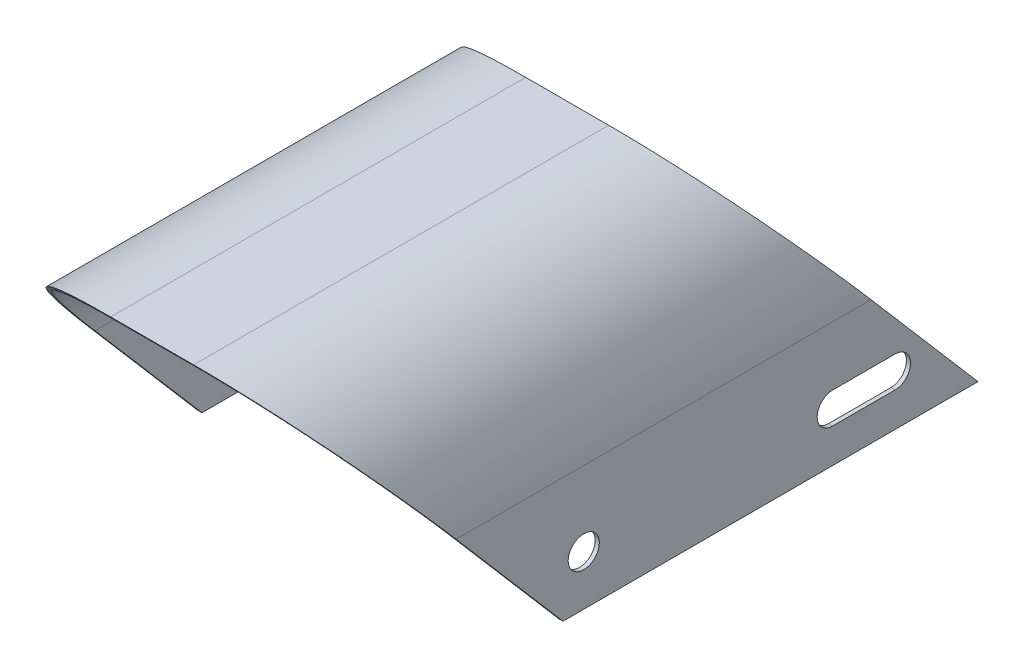
ISO-10303-21;
HEADER;
FILE_DESCRIPTION(('STEP AP214'),'2;1');
FILE_NAME('part.step','',(''),(''),'','','');
FILE_SCHEMA(('AUTOMOTIVE_DESIGN { 1 0 10303 214 1 1 1 1 }'));
ENDSEC;
DATA;
#1=APPLICATION_CONTEXT('core data for automotive mechanical design processes');
#2=APPLICATION_PROTOCOL_DEFINITION('international standard','automotive_design',2000,#1);
#3=PRODUCT_CONTEXT('',#1,'mechanical');
#4=PRODUCT('Part','Part','',(#3));
#5=PRODUCT_RELATED_PRODUCT_CATEGORY('part','',(#4));
#6=PRODUCT_DEFINITION_FORMATION('','',#4);
#7=PRODUCT_DEFINITION_CONTEXT('part definition',#1,'design');
#8=PRODUCT_DEFINITION('design','',#6,#7);
#9=PRODUCT_DEFINITION_SHAPE('','',#8);
#10=(LENGTH_UNIT() NAMED_UNIT(*) SI_UNIT(.MILLI.,.METRE.));
#11=(NAMED_UNIT(*) PLANE_ANGLE_UNIT() SI_UNIT($,.RADIAN.));
#12=(NAMED_UNIT(*) SI_UNIT($,.STERADIAN.) SOLID_ANGLE_UNIT());
#13=UNCERTAINTY_MEASURE_WITH_UNIT(LENGTH_MEASURE(1.E-05),#10,'distance_accuracy_value','');
#14=(GEOMETRIC_REPRESENTATION_CONTEXT(3) GLOBAL_UNCERTAINTY_ASSIGNED_CONTEXT((#13)) GLOBAL_UNIT_ASSIGNED_CONTEXT((#10,
#11,#12)) REPRESENTATION_CONTEXT('',''));
#15=CARTESIAN_POINT('',(0.,0.,0.));
#16=DIRECTION('',(0.,0.,1.));
#17=DIRECTION('',(1.,0.,0.));
#18=AXIS2_PLACEMENT_3D('',#15,#16,#17);
#19=CARTESIAN_POINT('',(-5.60292589790817,0.,196.85));
#20=DIRECTION('',(1.,0.,0.));
#21=DIRECTION('',(0.,0.,-1.));
#22=AXIS2_PLACEMENT_3D('',#19,#20,#21);
#23=PLANE('',#22);
#24=DIRECTION('',(0.,0.,1.));
#25=VECTOR('',#24,1.);
#26=CARTESIAN_POINT('',(-5.60292589790817,10.4775,25.4));
#27=LINE('',#26,#25);
#28=CARTESIAN_POINT('',(-5.60292589790817,10.4775,25.4));
#29=VERTEX_POINT('',#28);
#30=CARTESIAN_POINT('',(-5.60292589790817,10.4775,44.45));
#31=VERTEX_POINT('',#30);
#32=EDGE_CURVE('E191',#29,#31,#27,.T.);
#33=ORIENTED_EDGE('',*,*,#32,.F.);
#34=CARTESIAN_POINT('',(-5.60292589790817,15.24,25.4));
#35=DIRECTION('',(-1.,0.,0.));
#36=DIRECTION('',(0.,0.,1.));
#37=AXIS2_PLACEMENT_3D('',#34,#35,#36);
#38=CIRCLE('',#37,4.7625);
#39=CARTESIAN_POINT('',(-5.60292589790817,20.0025,25.4));
#40=VERTEX_POINT('',#39);
#41=EDGE_CURVE('E56',#40,#29,#38,.T.);
#42=ORIENTED_EDGE('',*,*,#41,.F.);
#43=DIRECTION('',(0.,0.,-1.));
#44=VECTOR('',#43,1.);
#45=CARTESIAN_POINT('',(-5.60292589790817,20.0025,25.4));
#46=LINE('',#45,#44);
#47=CARTESIAN_POINT('',(-5.60292589790817,20.0025,44.45));
#48=VERTEX_POINT('',#47);
#49=EDGE_CURVE('E199',#48,#40,#46,.T.);
#50=ORIENTED_EDGE('',*,*,#49,.F.);
#51=CARTESIAN_POINT('',(-5.60292589790817,15.24,44.45));
#52=DIRECTION('',(-1.,0.,0.));
#53=DIRECTION('',(0.,0.,-1.));
#54=AXIS2_PLACEMENT_3D('',#51,#52,#53);
#55=CIRCLE('',#54,4.7625);
#56=EDGE_CURVE('E181',#31,#48,#55,.T.);
#57=ORIENTED_EDGE('',*,*,#56,.F.);
#58=EDGE_LOOP('',(#33,#42,#50,#57));
#59=FACE_BOUND('',#58,.T.);
#60=CARTESIAN_POINT('',(-5.60292589790817,15.24,120.65));
#61=DIRECTION('',(-1.,0.,0.));
#62=DIRECTION('',(0.,0.,1.));
#63=AXIS2_PLACEMENT_3D('',#60,#61,#62);
#64=CIRCLE('',#63,4.76250000000004);
#65=CARTESIAN_POINT('',(-5.60292589790817,15.24,125.4125));
#66=VERTEX_POINT('',#65);
#67=EDGE_CURVE('E216',#66,#66,#64,.T.);
#68=ORIENTED_EDGE('',*,*,#67,.F.);
#69=EDGE_LOOP('',(#68));
#70=FACE_BOUND('',#69,.T.);
#71=DIRECTION('',(0.,0.,-1.));
#72=VECTOR('',#71,1.);
#73=CARTESIAN_POINT('',(-5.60292589790815,38.1,196.85));
#74=LINE('',#73,#72);
#75=CARTESIAN_POINT('',(-5.60292589790816,38.1,159.7421875));
#76=VERTEX_POINT('',#75);
#77=CARTESIAN_POINT('',(-5.60292589790816,38.1,32.7421875));
#78=VERTEX_POINT('',#77);
#79=EDGE_CURVE('E341',#76,#78,#74,.T.);
#80=ORIENTED_EDGE('',*,*,#79,.T.);
#81=DIRECTION('',(0.,0.758419483098748,0.651766743287986));
#82=VECTOR('',#81,1.);
#83=CARTESIAN_POINT('',(-5.60292589790817,0.,0.));
#84=LINE('',#83,#82);
#85=CARTESIAN_POINT('',(-5.60292589790817,0.,0.));
#86=VERTEX_POINT('',#85);
#87=EDGE_CURVE('E259',#86,#78,#84,.T.);
#88=ORIENTED_EDGE('',*,*,#87,.F.);
#89=DIRECTION('',(0.,0.,-1.));
#90=VECTOR('',#89,1.);
#91=CARTESIAN_POINT('',(-5.60292589790817,0.,196.85));
#92=LINE('',#91,#90);
#93=CARTESIAN_POINT('',(-5.60292589790817,0.,127.));
#94=VERTEX_POINT('',#93);
#95=EDGE_CURVE('E392',#94,#86,#92,.T.);
#96=ORIENTED_EDGE('',*,*,#95,.F.);
#97=DIRECTION('',(0.,-0.758419483098748,-0.651766743287987));
#98=VECTOR('',#97,1.);
#99=CARTESIAN_POINT('',(-5.60292589790817,81.2799999999999,196.85));
#100=LINE('',#99,#98);
#101=EDGE_CURVE('E258',#76,#94,#100,.T.);
#102=ORIENTED_EDGE('',*,*,#101,.F.);
#103=EDGE_LOOP('',(#80,#88,#96,#102));
#104=FACE_BOUND('',#103,.T.);
#105=ADVANCED_FACE('F41',(#59,#70,#104),#23,.F.);
#106=CARTESIAN_POINT('',(-5.60292589790817,0.,196.85));
#107=DIRECTION('',(0.,1.,0.));
#108=DIRECTION('',(-1.,0.,0.));
#109=AXIS2_PLACEMENT_3D('',#106,#107,#108);
#110=PLANE('',#109);
#111=DIRECTION('',(0.,0.,-1.));
#112=VECTOR('',#111,1.);
#113=CARTESIAN_POINT('',(-4.33292589790817,0.,196.85));
#114=LINE('',#113,#112);
#115=CARTESIAN_POINT('',(-4.3329258979081,0.,127.));
#116=VERTEX_POINT('',#115);
#117=CARTESIAN_POINT('',(-4.33292589790817,0.,0.));
#118=VERTEX_POINT('',#117);
#119=EDGE_CURVE('E388',#116,#118,#114,.T.);
#120=ORIENTED_EDGE('',*,*,#119,.F.);
#121=DIRECTION('',(-1.,0.,0.));
#122=VECTOR('',#121,1.);
#123=CARTESIAN_POINT('',(146.797074102092,0.,127.));
#124=LINE('',#123,#122);
#125=EDGE_CURVE('E270',#116,#94,#124,.T.);
#126=ORIENTED_EDGE('',*,*,#125,.T.);
#127=ORIENTED_EDGE('',*,*,#95,.T.);
#128=DIRECTION('',(1.,0.,0.));
#129=VECTOR('',#128,1.);
#130=CARTESIAN_POINT('',(-5.60292589790817,0.,0.));
#131=LINE('',#130,#129);
#132=EDGE_CURVE('E337',#86,#118,#131,.T.);
#133=ORIENTED_EDGE('',*,*,#132,.T.);
#134=EDGE_LOOP('',(#120,#126,#127,#133));
#135=FACE_BOUND('',#134,.T.);
#136=ADVANCED_FACE('F456',(#135),#110,.F.);
#137=CARTESIAN_POINT('',(-4.33292589790817,0.,196.85));
#138=DIRECTION('',(-1.,0.,0.));
#139=DIRECTION('',(0.,0.,1.));
#140=AXIS2_PLACEMENT_3D('',#137,#138,#139);
#141=PLANE('',#140);
#142=DIRECTION('',(0.,0.,-1.));
#143=VECTOR('',#142,1.);
#144=CARTESIAN_POINT('',(-4.33292589790817,20.0025,196.85));
#145=LINE('',#144,#143);
#146=CARTESIAN_POINT('',(-4.3329258979081,20.0025,44.45));
#147=VERTEX_POINT('',#146);
#148=CARTESIAN_POINT('',(-4.3329258979081,20.0025,25.4));
#149=VERTEX_POINT('',#148);
#150=EDGE_CURVE('E246',#147,#149,#145,.T.);
#151=ORIENTED_EDGE('',*,*,#150,.T.);
#152=CARTESIAN_POINT('',(-4.33292589790815,15.24,25.4));
#153=DIRECTION('',(-1.,0.,0.));
#154=DIRECTION('',(0.,0.,1.));
#155=AXIS2_PLACEMENT_3D('',#152,#153,#154);
#156=CIRCLE('',#155,4.7625);
#157=CARTESIAN_POINT('',(-4.3329258979081,10.4775,25.4));
#158=VERTEX_POINT('',#157);
#159=EDGE_CURVE('E254',#149,#158,#156,.T.);
#160=ORIENTED_EDGE('',*,*,#159,.T.);
#161=DIRECTION('',(0.,0.,1.));
#162=VECTOR('',#161,1.);
#163=CARTESIAN_POINT('',(-4.33292589790817,10.4775,196.85));
#164=LINE('',#163,#162);
#165=CARTESIAN_POINT('',(-4.33292589790817,10.4775,44.45));
#166=VERTEX_POINT('',#165);
#167=EDGE_CURVE('E233',#158,#166,#164,.T.);
#168=ORIENTED_EDGE('',*,*,#167,.T.);
#169=CARTESIAN_POINT('',(-4.33292589790815,15.24,44.45));
#170=DIRECTION('',(-1.,0.,0.));
#171=DIRECTION('',(0.,0.,1.));
#172=AXIS2_PLACEMENT_3D('',#169,#170,#171);
#173=CIRCLE('',#172,4.7625);
#174=EDGE_CURVE('E184',#166,#147,#173,.T.);
#175=ORIENTED_EDGE('',*,*,#174,.T.);
#176=EDGE_LOOP('',(#151,#160,#168,#175));
#177=FACE_BOUND('',#176,.T.);
#178=CARTESIAN_POINT('',(-4.33292589790815,15.24,120.65));
#179=DIRECTION('',(-1.,0.,0.));
#180=DIRECTION('',(0.,0.,1.));
#181=AXIS2_PLACEMENT_3D('',#178,#179,#180);
#182=CIRCLE('',#181,4.76250000000004);
#183=CARTESIAN_POINT('',(-4.33292589790812,15.24,125.4125));
#184=VERTEX_POINT('',#183);
#185=EDGE_CURVE('E224',#184,#184,#182,.T.);
#186=ORIENTED_EDGE('',*,*,#185,.T.);
#187=EDGE_LOOP('',(#186));
#188=FACE_BOUND('',#187,.T.);
#189=ORIENTED_EDGE('',*,*,#119,.T.);
#190=DIRECTION('',(0.,0.758419483098748,0.651766743287987));
#191=VECTOR('',#190,1.);
#192=CARTESIAN_POINT('',(-4.33292589790817,97.3054346299677,83.6218578851284));
#193=LINE('',#192,#191);
#194=CARTESIAN_POINT('',(-4.33292589790817,38.1,32.7421875));
#195=VERTEX_POINT('',#194);
#196=EDGE_CURVE('E301',#118,#195,#193,.T.);
#197=ORIENTED_EDGE('',*,*,#196,.T.);
#198=DIRECTION('',(0.,0.,-1.));
#199=VECTOR('',#198,1.);
#200=CARTESIAN_POINT('',(-4.33292589790817,38.1,196.85));
#201=LINE('',#200,#199);
#202=CARTESIAN_POINT('',(-4.33292589790817,38.1,159.7421875));
#203=VERTEX_POINT('',#202);
#204=EDGE_CURVE('E384',#203,#195,#201,.T.);
#205=ORIENTED_EDGE('',*,*,#204,.F.);
#206=DIRECTION('',(0.,-0.758419483098748,-0.651766743287987));
#207=VECTOR('',#206,1.);
#208=CARTESIAN_POINT('',(-4.33292589790817,34.5277348686982,156.672272152788));
#209=LINE('',#208,#207);
#210=EDGE_CURVE('E333',#203,#116,#209,.T.);
#211=ORIENTED_EDGE('',*,*,#210,.T.);
#212=EDGE_LOOP('',(#189,#197,#205,#211));
#213=FACE_BOUND('',#212,.T.);
#214=ADVANCED_FACE('F453',(#177,#188,#213),#141,.F.);
#215=CARTESIAN_POINT('',(37.5770741020918,38.1,196.85));
#216=DIRECTION('',(0.,0.,-1.));
#217=DIRECTION('',(-1.,0.,0.));
#218=AXIS2_PLACEMENT_3D('',#215,#216,#217);
#219=CYLINDRICAL_SURFACE('',#218,41.91);
#220=ORIENTED_EDGE('',*,*,#204,.T.);
#221=CARTESIAN_POINT('',(37.5770741020918,38.1,32.7421875));
#222=DIRECTION('',(0.,-0.651766743287986,0.758419483098748));
#223=DIRECTION('',(0.,-0.758419483098748,-0.651766743287986));
#224=AXIS2_PLACEMENT_3D('',#221,#222,#223);
#225=ELLIPSE('',#224,55.2596563431681,41.91);
#226=CARTESIAN_POINT('',(37.5770741020918,80.01,68.75859375));
#227=VERTEX_POINT('',#226);
#228=EDGE_CURVE('E297',#195,#227,#225,.F.);
#229=ORIENTED_EDGE('',*,*,#228,.T.);
#230=DIRECTION('',(0.,0.,-1.));
#231=VECTOR('',#230,1.);
#232=CARTESIAN_POINT('',(37.5770741020918,80.01,196.85));
#233=LINE('',#232,#231);
#234=CARTESIAN_POINT('',(37.5770741020918,80.01,195.75859375));
#235=VERTEX_POINT('',#234);
#236=EDGE_CURVE('E380',#235,#227,#233,.T.);
#237=ORIENTED_EDGE('',*,*,#236,.F.);
#238=CARTESIAN_POINT('',(37.5770741020918,38.1,159.7421875));
#239=DIRECTION('',(0.,0.651766743287987,-0.758419483098748));
#240=DIRECTION('',(0.,-0.758419483098748,-0.651766743287987));
#241=AXIS2_PLACEMENT_3D('',#238,#239,#240);
#242=ELLIPSE('',#241,55.2596563431681,41.91);
#243=EDGE_CURVE('E329',#235,#203,#242,.F.);
#244=ORIENTED_EDGE('',*,*,#243,.T.);
#245=EDGE_LOOP('',(#220,#229,#237,#244));
#246=FACE_BOUND('',#245,.T.);
#247=ADVANCED_FACE('F450',(#246),#219,.F.);
#248=CARTESIAN_POINT('',(37.5770741020918,80.01,196.85));
#249=DIRECTION('',(0.,1.,0.));
#250=DIRECTION('',(-1.,0.,0.));
#251=AXIS2_PLACEMENT_3D('',#248,#249,#250);
#252=PLANE('',#251);
#253=ORIENTED_EDGE('',*,*,#236,.T.);
#254=DIRECTION('',(1.,0.,0.));
#255=VECTOR('',#254,1.);
#256=CARTESIAN_POINT('',(37.5770741020919,80.01,68.75859375));
#257=LINE('',#256,#255);
#258=CARTESIAN_POINT('',(62.9770741020918,80.01,68.75859375));
#259=VERTEX_POINT('',#258);
#260=EDGE_CURVE('E293',#227,#259,#257,.T.);
#261=ORIENTED_EDGE('',*,*,#260,.T.);
#262=DIRECTION('',(0.,0.,-1.));
#263=VECTOR('',#262,1.);
#264=CARTESIAN_POINT('',(62.9770741020918,80.01,196.85));
#265=LINE('',#264,#263);
#266=CARTESIAN_POINT('',(62.9770741020918,80.01,195.75859375));
#267=VERTEX_POINT('',#266);
#268=EDGE_CURVE('E376',#267,#259,#265,.T.);
#269=ORIENTED_EDGE('',*,*,#268,.F.);
#270=DIRECTION('',(-1.,0.,0.));
#271=VECTOR('',#270,1.);
#272=CARTESIAN_POINT('',(37.5770741020918,80.01,195.75859375));
#273=LINE('',#272,#271);
#274=EDGE_CURVE('E325',#267,#235,#273,.T.);
#275=ORIENTED_EDGE('',*,*,#274,.T.);
#276=EDGE_LOOP('',(#253,#261,#269,#275));
#277=FACE_BOUND('',#276,.T.);
#278=ADVANCED_FACE('F447',(#277),#252,.F.);
#279=CARTESIAN_POINT('',(62.9770741020918,38.1,196.85));
#280=DIRECTION('',(0.,0.,-1.));
#281=DIRECTION('',(-1.,0.,0.));
#282=AXIS2_PLACEMENT_3D('',#279,#280,#281);
#283=CYLINDRICAL_SURFACE('',#282,41.91);
#284=ORIENTED_EDGE('',*,*,#268,.T.);
#285=CARTESIAN_POINT('',(62.9770741020918,38.1,32.7421875));
#286=DIRECTION('',(0.,-0.651766743287986,0.758419483098748));
#287=DIRECTION('',(0.,-0.758419483098748,-0.651766743287986));
#288=AXIS2_PLACEMENT_3D('',#285,#286,#287);
#289=ELLIPSE('',#288,55.2596563431681,41.91);
#290=CARTESIAN_POINT('',(104.887074102092,38.1,32.7421875));
#291=VERTEX_POINT('',#290);
#292=EDGE_CURVE('E289',#259,#291,#289,.F.);
#293=ORIENTED_EDGE('',*,*,#292,.T.);
#294=DIRECTION('',(0.,0.,-1.));
#295=VECTOR('',#294,1.);
#296=CARTESIAN_POINT('',(104.887074102092,38.1,196.85));
#297=LINE('',#296,#295);
#298=CARTESIAN_POINT('',(104.887074102092,38.1,159.7421875));
#299=VERTEX_POINT('',#298);
#300=EDGE_CURVE('E372',#299,#291,#297,.T.);
#301=ORIENTED_EDGE('',*,*,#300,.F.);
#302=CARTESIAN_POINT('',(62.9770741020918,38.1,159.7421875));
#303=DIRECTION('',(0.,0.651766743287987,-0.758419483098748));
#304=DIRECTION('',(0.,-0.758419483098748,-0.651766743287987));
#305=AXIS2_PLACEMENT_3D('',#302,#303,#304);
#306=ELLIPSE('',#305,55.2596563431681,41.91);
#307=EDGE_CURVE('E321',#299,#267,#306,.F.);
#308=ORIENTED_EDGE('',*,*,#307,.T.);
#309=EDGE_LOOP('',(#284,#293,#301,#308));
#310=FACE_BOUND('',#309,.T.);
#311=ADVANCED_FACE('F436',(#310),#283,.F.);
#312=CARTESIAN_POINT('',(104.887074102092,0.,196.85));
#313=DIRECTION('',(1.,0.,0.));
#314=DIRECTION('',(0.,0.,-1.));
#315=AXIS2_PLACEMENT_3D('',#312,#313,#314);
#316=PLANE('',#315);
#317=DIRECTION('',(0.,0.,-1.));
#318=VECTOR('',#317,1.);
#319=CARTESIAN_POINT('',(104.887074102092,10.4775,196.85));
#320=LINE('',#319,#318);
#321=CARTESIAN_POINT('',(104.887074102092,10.4775,44.45));
#322=VERTEX_POINT('',#321);
#323=CARTESIAN_POINT('',(104.887074102092,10.4775,25.4));
#324=VERTEX_POINT('',#323);
#325=EDGE_CURVE('E229',#322,#324,#320,.T.);
#326=ORIENTED_EDGE('',*,*,#325,.T.);
#327=CARTESIAN_POINT('',(104.887074102092,15.24,25.4));
#328=DIRECTION('',(1.,0.,0.));
#329=DIRECTION('',(0.,0.,-1.));
#330=AXIS2_PLACEMENT_3D('',#327,#328,#329);
#331=CIRCLE('',#330,4.7625);
#332=CARTESIAN_POINT('',(104.887074102092,20.0025,25.4));
#333=VERTEX_POINT('',#332);
#334=EDGE_CURVE('E250',#324,#333,#331,.T.);
#335=ORIENTED_EDGE('',*,*,#334,.T.);
#336=DIRECTION('',(0.,0.,1.));
#337=VECTOR('',#336,1.);
#338=CARTESIAN_POINT('',(104.887074102092,20.0025,196.85));
#339=LINE('',#338,#337);
#340=CARTESIAN_POINT('',(104.887074102092,20.0025,44.45));
#341=VERTEX_POINT('',#340);
#342=EDGE_CURVE('E242',#333,#341,#339,.T.);
#343=ORIENTED_EDGE('',*,*,#342,.T.);
#344=CARTESIAN_POINT('',(104.887074102092,15.24,44.45));
#345=DIRECTION('',(1.,0.,0.));
#346=DIRECTION('',(0.,0.,-1.));
#347=AXIS2_PLACEMENT_3D('',#344,#345,#346);
#348=CIRCLE('',#347,4.7625);
#349=EDGE_CURVE('E236',#341,#322,#348,.T.);
#350=ORIENTED_EDGE('',*,*,#349,.T.);
#351=EDGE_LOOP('',(#326,#335,#343,#350));
#352=FACE_BOUND('',#351,.T.);
#353=CARTESIAN_POINT('',(104.887074102092,15.24,120.65));
#354=DIRECTION('',(1.,0.,0.));
#355=DIRECTION('',(0.,0.,-1.));
#356=AXIS2_PLACEMENT_3D('',#353,#354,#355);
#357=CIRCLE('',#356,4.76250000000004);
#358=CARTESIAN_POINT('',(104.887074102092,15.24,125.4125));
#359=VERTEX_POINT('',#358);
#360=EDGE_CURVE('E220',#359,#359,#357,.T.);
#361=ORIENTED_EDGE('',*,*,#360,.T.);
#362=EDGE_LOOP('',(#361));
#363=FACE_BOUND('',#362,.T.);
#364=ORIENTED_EDGE('',*,*,#300,.T.);
#365=DIRECTION('',(0.,-0.758419483098748,-0.651766743287987));
#366=VECTOR('',#365,1.);
#367=CARTESIAN_POINT('',(104.887074102092,97.3054346299677,83.6218578851285));
#368=LINE('',#367,#366);
#369=CARTESIAN_POINT('',(104.887074102092,0.,0.));
#370=VERTEX_POINT('',#369);
#371=EDGE_CURVE('E285',#291,#370,#368,.T.);
#372=ORIENTED_EDGE('',*,*,#371,.T.);
#373=DIRECTION('',(0.,0.,-1.));
#374=VECTOR('',#373,1.);
#375=CARTESIAN_POINT('',(104.887074102092,0.,196.85));
#376=LINE('',#375,#374);
#377=CARTESIAN_POINT('',(104.887074102092,0.,127.));
#378=VERTEX_POINT('',#377);
#379=EDGE_CURVE('E368',#378,#370,#376,.T.);
#380=ORIENTED_EDGE('',*,*,#379,.F.);
#381=DIRECTION('',(0.,0.758419483098748,0.651766743287987));
#382=VECTOR('',#381,1.);
#383=CARTESIAN_POINT('',(104.887074102092,34.5277348686982,156.672272152788));
#384=LINE('',#383,#382);
#385=EDGE_CURVE('E317',#378,#299,#384,.T.);
#386=ORIENTED_EDGE('',*,*,#385,.T.);
#387=EDGE_LOOP('',(#364,#372,#380,#386));
#388=FACE_BOUND('',#387,.T.);
#389=ADVANCED_FACE('F432',(#352,#363,#388),#316,.F.);
#390=CARTESIAN_POINT('',(106.157074102092,0.,196.85));
#391=DIRECTION('',(0.,1.,0.));
#392=DIRECTION('',(0.,0.,1.));
#393=AXIS2_PLACEMENT_3D('',#390,#391,#392);
#394=PLANE('',#393);
#395=DIRECTION('',(0.,0.,-1.));
#396=VECTOR('',#395,1.);
#397=CARTESIAN_POINT('',(106.157074102092,0.,196.85));
#398=LINE('',#397,#396);
#399=CARTESIAN_POINT('',(106.157074102092,0.,127.));
#400=VERTEX_POINT('',#399);
#401=CARTESIAN_POINT('',(106.157074102092,0.,0.));
#402=VERTEX_POINT('',#401);
#403=EDGE_CURVE('E364',#400,#402,#398,.T.);
#404=ORIENTED_EDGE('',*,*,#403,.F.);
#405=EDGE_CURVE('E263',#400,#378,#124,.T.);
#406=ORIENTED_EDGE('',*,*,#405,.T.);
#407=ORIENTED_EDGE('',*,*,#379,.T.);
#408=DIRECTION('',(1.,0.,0.));
#409=VECTOR('',#408,1.);
#410=CARTESIAN_POINT('',(106.157074102092,0.,0.));
#411=LINE('',#410,#409);
#412=EDGE_CURVE('E342',#370,#402,#411,.T.);
#413=ORIENTED_EDGE('',*,*,#412,.T.);
#414=EDGE_LOOP('',(#404,#406,#407,#413));
#415=FACE_BOUND('',#414,.T.);
#416=ADVANCED_FACE('F435',(#415),#394,.F.);
#417=CARTESIAN_POINT('',(106.157074102092,38.1,196.85));
#418=DIRECTION('',(-1.,0.,0.));
#419=DIRECTION('',(0.,0.,1.));
#420=AXIS2_PLACEMENT_3D('',#417,#418,#419);
#421=PLANE('',#420);
#422=DIRECTION('',(0.,0.,-1.));
#423=VECTOR('',#422,1.);
#424=CARTESIAN_POINT('',(106.157074102092,20.0025,196.85));
#425=LINE('',#424,#423);
#426=CARTESIAN_POINT('',(106.157074102092,20.0025,44.45));
#427=VERTEX_POINT('',#426);
#428=CARTESIAN_POINT('',(106.157074102092,20.0025,25.4));
#429=VERTEX_POINT('',#428);
#430=EDGE_CURVE('E49',#427,#429,#425,.T.);
#431=ORIENTED_EDGE('',*,*,#430,.T.);
#432=CARTESIAN_POINT('',(106.157074102092,15.24,25.4));
#433=DIRECTION('',(-1.,0.,0.));
#434=DIRECTION('',(0.,0.,1.));
#435=AXIS2_PLACEMENT_3D('',#432,#433,#434);
#436=CIRCLE('',#435,4.7625);
#437=CARTESIAN_POINT('',(106.157074102092,10.4775,25.4));
#438=VERTEX_POINT('',#437);
#439=EDGE_CURVE('E11',#429,#438,#436,.T.);
#440=ORIENTED_EDGE('',*,*,#439,.T.);
#441=DIRECTION('',(0.,0.,1.));
#442=VECTOR('',#441,1.);
#443=CARTESIAN_POINT('',(106.157074102092,10.4775,196.85));
#444=LINE('',#443,#442);
#445=CARTESIAN_POINT('',(106.157074102092,10.4775,44.45));
#446=VERTEX_POINT('',#445);
#447=EDGE_CURVE('E396',#438,#446,#444,.T.);
#448=ORIENTED_EDGE('',*,*,#447,.T.);
#449=CARTESIAN_POINT('',(106.157074102092,15.24,44.45));
#450=DIRECTION('',(-1.,0.,0.));
#451=DIRECTION('',(0.,0.,1.));
#452=AXIS2_PLACEMENT_3D('',#449,#450,#451);
#453=CIRCLE('',#452,4.7625);
#454=EDGE_CURVE('E403',#446,#427,#453,.T.);
#455=ORIENTED_EDGE('',*,*,#454,.T.);
#456=EDGE_LOOP('',(#431,#440,#448,#455));
#457=FACE_BOUND('',#456,.T.);
#458=CARTESIAN_POINT('',(106.157074102092,15.24,120.65));
#459=DIRECTION('',(-1.,0.,0.));
#460=DIRECTION('',(0.,0.,1.));
#461=AXIS2_PLACEMENT_3D('',#458,#459,#460);
#462=CIRCLE('',#461,4.76250000000004);
#463=CARTESIAN_POINT('',(106.157074102092,15.24,125.4125));
#464=VERTEX_POINT('',#463);
#465=EDGE_CURVE('E225',#464,#464,#462,.T.);
#466=ORIENTED_EDGE('',*,*,#465,.T.);
#467=EDGE_LOOP('',(#466));
#468=FACE_BOUND('',#467,.T.);
#469=ORIENTED_EDGE('',*,*,#403,.T.);
#470=DIRECTION('',(0.,0.758419483098748,0.651766743287987));
#471=VECTOR('',#470,1.);
#472=CARTESIAN_POINT('',(106.157074102092,119.220558910265,102.455167813509));
#473=LINE('',#472,#471);
#474=CARTESIAN_POINT('',(106.157074102092,38.1,32.7421875));
#475=VERTEX_POINT('',#474);
#476=EDGE_CURVE('E281',#402,#475,#473,.T.);
#477=ORIENTED_EDGE('',*,*,#476,.T.);
#478=DIRECTION('',(0.,0.,-1.));
#479=VECTOR('',#478,1.);
#480=CARTESIAN_POINT('',(106.157074102092,38.1,196.85));
#481=LINE('',#480,#479);
#482=CARTESIAN_POINT('',(106.157074102092,38.1,159.7421875));
#483=VERTEX_POINT('',#482);
#484=EDGE_CURVE('E360',#483,#475,#481,.T.);
#485=ORIENTED_EDGE('',*,*,#484,.F.);
#486=DIRECTION('',(0.,-0.758419483098748,-0.651766743287987));
#487=VECTOR('',#486,1.);
#488=CARTESIAN_POINT('',(106.157074102092,56.4428591489959,175.505582081168));
#489=LINE('',#488,#487);
#490=EDGE_CURVE('E313',#483,#400,#489,.T.);
#491=ORIENTED_EDGE('',*,*,#490,.T.);
#492=EDGE_LOOP('',(#469,#477,#485,#491));
#493=FACE_BOUND('',#492,.T.);
#494=ADVANCED_FACE('F409',(#457,#468,#493),#421,.F.);
#495=CARTESIAN_POINT('',(62.9770741020918,38.1,196.85));
#496=DIRECTION('',(0.,0.,-1.));
#497=DIRECTION('',(-1.,0.,0.));
#498=AXIS2_PLACEMENT_3D('',#495,#496,#497);
#499=CYLINDRICAL_SURFACE('',#498,43.18);
#500=ORIENTED_EDGE('',*,*,#484,.T.);
#501=CARTESIAN_POINT('',(62.9770741020918,38.1,32.7421875));
#502=DIRECTION('',(0.,-0.651766743287986,0.758419483098748));
#503=DIRECTION('',(0.,-0.758419483098748,-0.651766743287986));
#504=AXIS2_PLACEMENT_3D('',#501,#502,#503);
#505=ELLIPSE('',#504,56.9341913838702,43.18);
#506=CARTESIAN_POINT('',(62.9770741020918,81.28,69.85));
#507=VERTEX_POINT('',#506);
#508=EDGE_CURVE('E277',#475,#507,#505,.T.);
#509=ORIENTED_EDGE('',*,*,#508,.T.);
#510=DIRECTION('',(0.,0.,-1.));
#511=VECTOR('',#510,1.);
#512=CARTESIAN_POINT('',(62.9770741020918,81.28,196.85));
#513=LINE('',#512,#511);
#514=CARTESIAN_POINT('',(62.9770741020918,81.28,196.85));
#515=VERTEX_POINT('',#514);
#516=EDGE_CURVE('E356',#515,#507,#513,.T.);
#517=ORIENTED_EDGE('',*,*,#516,.F.);
#518=CARTESIAN_POINT('',(62.9770741020918,38.1,159.7421875));
#519=DIRECTION('',(0.,0.651766743287987,-0.758419483098748));
#520=DIRECTION('',(0.,-0.758419483098748,-0.651766743287987));
#521=AXIS2_PLACEMENT_3D('',#518,#519,#520);
#522=ELLIPSE('',#521,56.9341913838702,43.18);
#523=EDGE_CURVE('E309',#515,#483,#522,.T.);
#524=ORIENTED_EDGE('',*,*,#523,.T.);
#525=EDGE_LOOP('',(#500,#509,#517,#524));
#526=FACE_BOUND('',#525,.T.);
#527=ADVANCED_FACE('F470',(#526),#499,.T.);
#528=CARTESIAN_POINT('',(37.5770741020918,81.2799999999999,196.85));
#529=DIRECTION('',(0.,-1.,0.));
#530=DIRECTION('',(1.,0.,0.));
#531=AXIS2_PLACEMENT_3D('',#528,#529,#530);
#532=PLANE('',#531);
#533=ORIENTED_EDGE('',*,*,#516,.T.);
#534=DIRECTION('',(-1.,0.,0.));
#535=VECTOR('',#534,1.);
#536=CARTESIAN_POINT('',(146.797074102092,81.28,69.85));
#537=LINE('',#536,#535);
#538=CARTESIAN_POINT('',(37.5770741020918,81.28,69.85));
#539=VERTEX_POINT('',#538);
#540=EDGE_CURVE('E262',#507,#539,#537,.T.);
#541=ORIENTED_EDGE('',*,*,#540,.T.);
#542=DIRECTION('',(0.,0.,-1.));
#543=VECTOR('',#542,1.);
#544=CARTESIAN_POINT('',(37.5770741020918,81.2799999999999,196.85));
#545=LINE('',#544,#543);
#546=CARTESIAN_POINT('',(37.5770741020918,81.2799999999999,196.85));
#547=VERTEX_POINT('',#546);
#548=EDGE_CURVE('E352',#547,#539,#545,.T.);
#549=ORIENTED_EDGE('',*,*,#548,.F.);
#550=DIRECTION('',(-1.,0.,0.));
#551=VECTOR('',#550,1.);
#552=CARTESIAN_POINT('',(37.5770741020918,81.2799999999999,196.85));
#553=LINE('',#552,#551);
#554=EDGE_CURVE('E338',#515,#547,#553,.T.);
#555=ORIENTED_EDGE('',*,*,#554,.F.);
#556=EDGE_LOOP('',(#533,#541,#549,#555));
#557=FACE_BOUND('',#556,.T.);
#558=ADVANCED_FACE('F466',(#557),#532,.F.);
#559=CARTESIAN_POINT('',(37.5770741020918,38.1,196.85));
#560=DIRECTION('',(0.,0.,-1.));
#561=DIRECTION('',(-1.,0.,0.));
#562=AXIS2_PLACEMENT_3D('',#559,#560,#561);
#563=CYLINDRICAL_SURFACE('',#562,43.18);
#564=ORIENTED_EDGE('',*,*,#548,.T.);
#565=CARTESIAN_POINT('',(37.5770741020918,38.1,32.7421875));
#566=DIRECTION('',(0.,-0.651766743287986,0.758419483098748));
#567=DIRECTION('',(0.,-0.758419483098748,-0.651766743287986));
#568=AXIS2_PLACEMENT_3D('',#565,#566,#567);
#569=ELLIPSE('',#568,56.9341913838702,43.18);
#570=EDGE_CURVE('E267',#539,#78,#569,.T.);
#571=ORIENTED_EDGE('',*,*,#570,.T.);
#572=ORIENTED_EDGE('',*,*,#79,.F.);
#573=CARTESIAN_POINT('',(37.5770741020918,38.1,159.7421875));
#574=DIRECTION('',(0.,0.651766743287987,-0.758419483098748));
#575=DIRECTION('',(0.,-0.758419483098748,-0.651766743287987));
#576=AXIS2_PLACEMENT_3D('',#573,#574,#575);
#577=ELLIPSE('',#576,56.9341913838702,43.18);
#578=EDGE_CURVE('E305',#76,#547,#577,.T.);
#579=ORIENTED_EDGE('',*,*,#578,.T.);
#580=EDGE_LOOP('',(#564,#571,#572,#579));
#581=FACE_BOUND('',#580,.T.);
#582=ADVANCED_FACE('F463',(#581),#563,.T.);
#583=CARTESIAN_POINT('',(146.797074102092,0.,0.));
#584=DIRECTION('',(0.,-0.651766743287986,0.758419483098748));
#585=DIRECTION('',(0.,-0.758419483098748,-0.651766743287987));
#586=AXIS2_PLACEMENT_3D('',#583,#584,#585);
#587=PLANE('',#586);
#588=ORIENTED_EDGE('',*,*,#132,.F.);
#589=ORIENTED_EDGE('',*,*,#87,.T.);
#590=ORIENTED_EDGE('',*,*,#570,.F.);
#591=ORIENTED_EDGE('',*,*,#540,.F.);
#592=ORIENTED_EDGE('',*,*,#508,.F.);
#593=ORIENTED_EDGE('',*,*,#476,.F.);
#594=ORIENTED_EDGE('',*,*,#412,.F.);
#595=ORIENTED_EDGE('',*,*,#371,.F.);
#596=ORIENTED_EDGE('',*,*,#292,.F.);
#597=ORIENTED_EDGE('',*,*,#260,.F.);
#598=ORIENTED_EDGE('',*,*,#228,.F.);
#599=ORIENTED_EDGE('',*,*,#196,.F.);
#600=EDGE_LOOP('',(#588,#589,#590,#591,#592,#593,#594,#595,#596,#597,#598,#599));
#601=FACE_BOUND('',#600,.T.);
#602=ADVANCED_FACE('F445',(#601),#587,.F.);
#603=CARTESIAN_POINT('',(146.797074102092,81.2799999999999,196.85));
#604=DIRECTION('',(0.,0.651766743287987,-0.758419483098748));
#605=DIRECTION('',(0.,0.758419483098748,0.651766743287987));
#606=AXIS2_PLACEMENT_3D('',#603,#604,#605);
#607=PLANE('',#606);
#608=ORIENTED_EDGE('',*,*,#243,.F.);
#609=ORIENTED_EDGE('',*,*,#274,.F.);
#610=ORIENTED_EDGE('',*,*,#307,.F.);
#611=ORIENTED_EDGE('',*,*,#385,.F.);
#612=ORIENTED_EDGE('',*,*,#405,.F.);
#613=ORIENTED_EDGE('',*,*,#490,.F.);
#614=ORIENTED_EDGE('',*,*,#523,.F.);
#615=ORIENTED_EDGE('',*,*,#554,.T.);
#616=ORIENTED_EDGE('',*,*,#578,.F.);
#617=ORIENTED_EDGE('',*,*,#101,.T.);
#618=ORIENTED_EDGE('',*,*,#125,.F.);
#619=ORIENTED_EDGE('',*,*,#210,.F.);
#620=EDGE_LOOP('',(#608,#609,#610,#611,#612,#613,#614,#615,#616,#617,#618,#619));
#621=FACE_BOUND('',#620,.T.);
#622=ADVANCED_FACE('F478',(#621),#607,.F.);
#623=CARTESIAN_POINT('',(146.797074102092,15.24,120.65));
#624=DIRECTION('',(-1.,0.,0.));
#625=DIRECTION('',(0.,0.,1.));
#626=AXIS2_PLACEMENT_3D('',#623,#624,#625);
#627=CYLINDRICAL_SURFACE('',#626,4.76250000000004);
#628=CARTESIAN_POINT('',(106.157074102092,15.24,125.4125));
#629=CARTESIAN_POINT('',(106.143844935425,15.24,125.4125));
#630=CARTESIAN_POINT('',(106.130615768758,15.24,125.4125));
#631=CARTESIAN_POINT('',(106.104157435425,15.24,125.4125));
#632=CARTESIAN_POINT('',(106.090928268758,15.24,125.4125));
#633=CARTESIAN_POINT('',(106.064469935425,15.24,125.4125));
#634=CARTESIAN_POINT('',(106.051240768758,15.24,125.4125));
#635=CARTESIAN_POINT('',(106.024782435425,15.24,125.4125));
#636=CARTESIAN_POINT('',(106.011553268758,15.24,125.4125));
#637=CARTESIAN_POINT('',(105.985094935425,15.24,125.4125));
#638=CARTESIAN_POINT('',(105.971865768758,15.24,125.4125));
#639=CARTESIAN_POINT('',(105.945407435425,15.24,125.4125));
#640=CARTESIAN_POINT('',(105.932178268758,15.24,125.4125));
#641=CARTESIAN_POINT('',(105.905719935425,15.24,125.4125));
#642=CARTESIAN_POINT('',(105.892490768758,15.24,125.4125));
#643=CARTESIAN_POINT('',(105.866032435425,15.24,125.4125));
#644=CARTESIAN_POINT('',(105.852803268758,15.24,125.4125));
#645=CARTESIAN_POINT('',(105.826344935425,15.24,125.4125));
#646=CARTESIAN_POINT('',(105.813115768758,15.24,125.4125));
#647=CARTESIAN_POINT('',(105.786657435425,15.24,125.4125));
#648=CARTESIAN_POINT('',(105.773428268758,15.24,125.4125));
#649=CARTESIAN_POINT('',(105.746969935425,15.24,125.4125));
#650=CARTESIAN_POINT('',(105.733740768758,15.24,125.4125));
#651=CARTESIAN_POINT('',(105.707282435425,15.24,125.4125));
#652=CARTESIAN_POINT('',(105.694053268758,15.24,125.4125));
#653=CARTESIAN_POINT('',(105.667594935425,15.24,125.4125));
#654=CARTESIAN_POINT('',(105.654365768758,15.24,125.4125));
#655=CARTESIAN_POINT('',(105.627907435425,15.24,125.4125));
#656=CARTESIAN_POINT('',(105.614678268758,15.24,125.4125));
#657=CARTESIAN_POINT('',(105.588219935425,15.24,125.4125));
#658=CARTESIAN_POINT('',(105.574990768758,15.24,125.4125));
#659=CARTESIAN_POINT('',(105.548532435425,15.24,125.4125));
#660=CARTESIAN_POINT('',(105.535303268758,15.24,125.4125));
#661=CARTESIAN_POINT('',(105.508844935425,15.24,125.4125));
#662=CARTESIAN_POINT('',(105.495615768758,15.24,125.4125));
#663=CARTESIAN_POINT('',(105.469157435425,15.24,125.4125));
#664=CARTESIAN_POINT('',(105.455928268758,15.24,125.4125));
#665=CARTESIAN_POINT('',(105.429469935425,15.24,125.4125));
#666=CARTESIAN_POINT('',(105.416240768758,15.24,125.4125));
#667=CARTESIAN_POINT('',(105.389782435425,15.24,125.4125));
#668=CARTESIAN_POINT('',(105.376553268758,15.24,125.4125));
#669=CARTESIAN_POINT('',(105.350094935425,15.24,125.4125));
#670=CARTESIAN_POINT('',(105.336865768758,15.24,125.4125));
#671=CARTESIAN_POINT('',(105.310407435425,15.24,125.4125));
#672=CARTESIAN_POINT('',(105.297178268758,15.24,125.4125));
#673=CARTESIAN_POINT('',(105.270719935425,15.24,125.4125));
#674=CARTESIAN_POINT('',(105.257490768758,15.24,125.4125));
#675=CARTESIAN_POINT('',(105.231032435425,15.24,125.4125));
#676=CARTESIAN_POINT('',(105.217803268758,15.24,125.4125));
#677=CARTESIAN_POINT('',(105.191344935425,15.24,125.4125));
#678=CARTESIAN_POINT('',(105.178115768758,15.24,125.4125));
#679=CARTESIAN_POINT('',(105.151657435425,15.24,125.4125));
#680=CARTESIAN_POINT('',(105.138428268758,15.24,125.4125));
#681=CARTESIAN_POINT('',(105.111969935425,15.24,125.4125));
#682=CARTESIAN_POINT('',(105.098740768758,15.24,125.4125));
#683=CARTESIAN_POINT('',(105.072282435425,15.24,125.4125));
#684=CARTESIAN_POINT('',(105.059053268758,15.24,125.4125));
#685=CARTESIAN_POINT('',(105.032594935425,15.24,125.4125));
#686=CARTESIAN_POINT('',(105.019365768758,15.24,125.4125));
#687=CARTESIAN_POINT('',(104.992907435425,15.24,125.4125));
#688=CARTESIAN_POINT('',(104.979678268758,15.24,125.4125));
#689=CARTESIAN_POINT('',(104.953219935425,15.24,125.4125));
#690=CARTESIAN_POINT('',(104.939990768758,15.24,125.4125));
#691=CARTESIAN_POINT('',(104.913532435425,15.24,125.4125));
#692=CARTESIAN_POINT('',(104.900303268758,15.24,125.4125));
#693=CARTESIAN_POINT('',(104.887074102092,15.24,125.4125));
#694=B_SPLINE_CURVE_WITH_KNOTS('',3,(#628,#629,#630,#631,#632,#633,#634,#635,#636,#637,#638,
#639,#640,#641,#642,#643,#644,#645,#646,#647,#648,#649,#650,#651,#652,#653,#654,#655,#656,#657,
#658,#659,#660,#661,#662,#663,#664,#665,#666,#667,#668,#669,#670,#671,#672,#673,#674,#675,#676,
#677,#678,#679,#680,#681,#682,#683,#684,#685,#686,#687,#688,#689,#690,#691,#692,#693),
.UNSPECIFIED.,.F.,.F.,(4,2,2,2,2,2,2,2,2,2,2,2,2,2,2,2,2,2,2,2,2,2,2,2,2,2,2,2,2,2,2,2,4),(0.,
0.0396874999999963,0.0793749999999926,0.119062499999989,0.158749999999985,0.198437499999995,
0.238124999999992,0.277812500000002,0.317499999999998,0.357187499999995,0.396874999999991,
0.436562499999987,0.476249999999998,0.515937499999994,0.555625000000004,0.5953125,
0.634999999999997,0.674687499999993,0.714374999999989,0.7540625,0.793749999999996,
0.833437500000006,0.873125000000002,0.912812499999999,0.952499999999995,0.992187499999991,
1.031875,1.0715625,1.11125000000001,1.1509375,1.190625,1.2303125,1.26999999999999),.UNSPECIFIED.);
#695=EDGE_CURVE('BSEAM480',#464,#359,#694,.T.);
#696=ORIENTED_EDGE('',*,*,#465,.F.);
#697=ORIENTED_EDGE('',*,*,#360,.F.);
#698=ORIENTED_EDGE('',*,*,#695,.T.);
#699=ORIENTED_EDGE('',*,*,#695,.F.);
#700=EDGE_LOOP('',(#696,#698,#697,#699));
#701=FACE_BOUND('',#700,.T.);
#702=ADVANCED_FACE('F480',(#701),#627,.F.);
#703=CARTESIAN_POINT('',(146.797074102092,10.4775,25.4));
#704=DIRECTION('',(0.,-1.,0.));
#705=DIRECTION('',(0.,0.,-1.));
#706=AXIS2_PLACEMENT_3D('',#703,#704,#705);
#707=PLANE('',#706);
#708=DIRECTION('',(-1.,0.,0.));
#709=VECTOR('',#708,1.);
#710=CARTESIAN_POINT('',(146.797074102092,10.4775,44.45));
#711=LINE('',#710,#709);
#712=EDGE_CURVE('E187',#446,#322,#711,.T.);
#713=ORIENTED_EDGE('',*,*,#712,.F.);
#714=ORIENTED_EDGE('',*,*,#447,.F.);
#715=DIRECTION('',(-1.,0.,0.));
#716=VECTOR('',#715,1.);
#717=CARTESIAN_POINT('',(146.797074102092,10.4775,25.4));
#718=LINE('',#717,#716);
#719=EDGE_CURVE('E188',#438,#324,#718,.T.);
#720=ORIENTED_EDGE('',*,*,#719,.T.);
#721=ORIENTED_EDGE('',*,*,#325,.F.);
#722=EDGE_LOOP('',(#713,#714,#720,#721));
#723=FACE_BOUND('',#722,.T.);
#724=ADVANCED_FACE('F428',(#723),#707,.F.);
#725=CARTESIAN_POINT('',(146.797074102092,15.24,44.45));
#726=DIRECTION('',(-1.,0.,0.));
#727=DIRECTION('',(0.,0.,1.));
#728=AXIS2_PLACEMENT_3D('',#725,#726,#727);
#729=CYLINDRICAL_SURFACE('',#728,4.7625);
#730=DIRECTION('',(-1.,0.,0.));
#731=VECTOR('',#730,1.);
#732=CARTESIAN_POINT('',(146.797074102092,20.0025,44.45));
#733=LINE('',#732,#731);
#734=EDGE_CURVE('E210',#427,#341,#733,.T.);
#735=ORIENTED_EDGE('',*,*,#734,.F.);
#736=ORIENTED_EDGE('',*,*,#454,.F.);
#737=ORIENTED_EDGE('',*,*,#712,.T.);
#738=ORIENTED_EDGE('',*,*,#349,.F.);
#739=EDGE_LOOP('',(#735,#736,#737,#738));
#740=FACE_BOUND('',#739,.T.);
#741=ADVANCED_FACE('F419',(#740),#729,.F.);
#742=CARTESIAN_POINT('',(146.797074102092,20.0025,25.4));
#743=DIRECTION('',(0.,1.,0.));
#744=DIRECTION('',(0.,0.,1.));
#745=AXIS2_PLACEMENT_3D('',#742,#743,#744);
#746=PLANE('',#745);
#747=DIRECTION('',(-1.,0.,0.));
#748=VECTOR('',#747,1.);
#749=CARTESIAN_POINT('',(146.797074102092,20.0025,25.4));
#750=LINE('',#749,#748);
#751=EDGE_CURVE('E209',#429,#333,#750,.T.);
#752=ORIENTED_EDGE('',*,*,#751,.F.);
#753=ORIENTED_EDGE('',*,*,#430,.F.);
#754=ORIENTED_EDGE('',*,*,#734,.T.);
#755=ORIENTED_EDGE('',*,*,#342,.F.);
#756=EDGE_LOOP('',(#752,#753,#754,#755));
#757=FACE_BOUND('',#756,.T.);
#758=ADVANCED_FACE('F416',(#757),#746,.F.);
#759=CARTESIAN_POINT('',(146.797074102092,15.24,25.4));
#760=DIRECTION('',(-1.,0.,0.));
#761=DIRECTION('',(0.,0.,1.));
#762=AXIS2_PLACEMENT_3D('',#759,#760,#761);
#763=CYLINDRICAL_SURFACE('',#762,4.7625);
#764=ORIENTED_EDGE('',*,*,#719,.F.);
#765=ORIENTED_EDGE('',*,*,#439,.F.);
#766=ORIENTED_EDGE('',*,*,#751,.T.);
#767=ORIENTED_EDGE('',*,*,#334,.F.);
#768=EDGE_LOOP('',(#764,#765,#766,#767));
#769=FACE_BOUND('',#768,.T.);
#770=ADVANCED_FACE('F430',(#769),#763,.F.);
#771=CARTESIAN_POINT('',(-5.60292589790817,15.24,125.4125));
#772=CARTESIAN_POINT('',(-5.58969673124151,15.24,125.4125));
#773=CARTESIAN_POINT('',(-5.57646756457484,15.24,125.4125));
#774=CARTESIAN_POINT('',(-5.55000923124151,15.24,125.4125));
#775=CARTESIAN_POINT('',(-5.53678006457485,15.24,125.4125));
#776=CARTESIAN_POINT('',(-5.51032173124151,15.24,125.4125));
#777=CARTESIAN_POINT('',(-5.49709256457483,15.24,125.4125));
#778=CARTESIAN_POINT('',(-5.47063423124149,15.24,125.4125));
#779=CARTESIAN_POINT('',(-5.45740506457483,15.24,125.4125));
#780=CARTESIAN_POINT('',(-5.43094673124149,15.24,125.4125));
#781=CARTESIAN_POINT('',(-5.41771756457483,15.24,125.4125));
#782=CARTESIAN_POINT('',(-5.3912592312415,15.24,125.4125));
#783=CARTESIAN_POINT('',(-5.37803006457483,15.24,125.4125));
#784=CARTESIAN_POINT('',(-5.3515717312415,15.24,125.4125));
#785=CARTESIAN_POINT('',(-5.33834256457484,15.24,125.4125));
#786=CARTESIAN_POINT('',(-5.3118842312415,15.24,125.4125));
#787=CARTESIAN_POINT('',(-5.29865506457482,15.24,125.4125));
#788=CARTESIAN_POINT('',(-5.27219673124148,15.24,125.4125));
#789=CARTESIAN_POINT('',(-5.25896756457482,15.24,125.4125));
#790=CARTESIAN_POINT('',(-5.23250923124148,15.24,125.4125));
#791=CARTESIAN_POINT('',(-5.21928006457482,15.24,125.4125));
#792=CARTESIAN_POINT('',(-5.19282173124149,15.24,125.4125));
#793=CARTESIAN_POINT('',(-5.17959256457482,15.24,125.4125));
#794=CARTESIAN_POINT('',(-5.15313423124149,15.24,125.4125));
#795=CARTESIAN_POINT('',(-5.13990506457483,15.24,125.4125));
#796=CARTESIAN_POINT('',(-5.1134467312415,15.24,125.4125));
#797=CARTESIAN_POINT('',(-5.10021756457483,15.24,125.4125));
#798=CARTESIAN_POINT('',(-5.07375923124149,15.24,125.4125));
#799=CARTESIAN_POINT('',(-5.06053006457482,15.24,125.4125));
#800=CARTESIAN_POINT('',(-5.03407173124148,15.24,125.4125));
#801=CARTESIAN_POINT('',(-5.02084256457481,15.24,125.4125));
#802=CARTESIAN_POINT('',(-4.99438423124148,15.24,125.4125));
#803=CARTESIAN_POINT('',(-4.98115506457481,15.24,125.4125));
#804=CARTESIAN_POINT('',(-4.95469673124148,15.24,125.4125));
#805=CARTESIAN_POINT('',(-4.94146756457482,15.24,125.4125));
#806=CARTESIAN_POINT('',(-4.91500923124149,15.24,125.4125));
#807=CARTESIAN_POINT('',(-4.90178006457482,15.24,125.4125));
#808=CARTESIAN_POINT('',(-4.87532173124148,15.24,125.4125));
#809=CARTESIAN_POINT('',(-4.86209256457481,15.24,125.4125));
#810=CARTESIAN_POINT('',(-4.83563423124147,15.24,125.4125));
#811=CARTESIAN_POINT('',(-4.8224050645748,15.24,125.4125));
#812=CARTESIAN_POINT('',(-4.79594673124147,15.24,125.4125));
#813=CARTESIAN_POINT('',(-4.7827175645748,15.24,125.4125));
#814=CARTESIAN_POINT('',(-4.75625923124147,15.24,125.4125));
#815=CARTESIAN_POINT('',(-4.74303006457481,15.24,125.4125));
#816=CARTESIAN_POINT('',(-4.71657173124148,15.24,125.4125));
#817=CARTESIAN_POINT('',(-4.70334256457481,15.24,125.4125));
#818=CARTESIAN_POINT('',(-4.67688423124148,15.24,125.4125));
#819=CARTESIAN_POINT('',(-4.66365506457482,15.24,125.4125));
#820=CARTESIAN_POINT('',(-4.63719673124148,15.24,125.4125));
#821=CARTESIAN_POINT('',(-4.6239675645748,15.24,125.4125));
#822=CARTESIAN_POINT('',(-4.59750923124146,15.24,125.4125));
#823=CARTESIAN_POINT('',(-4.5842800645748,15.24,125.4125));
#824=CARTESIAN_POINT('',(-4.55782173124146,15.24,125.4125));
#825=CARTESIAN_POINT('',(-4.5445925645748,15.24,125.4125));
#826=CARTESIAN_POINT('',(-4.51813423124147,15.24,125.4125));
#827=CARTESIAN_POINT('',(-4.5049050645748,15.24,125.4125));
#828=CARTESIAN_POINT('',(-4.47844673124147,15.24,125.4125));
#829=CARTESIAN_POINT('',(-4.46521756457481,15.24,125.4125));
#830=CARTESIAN_POINT('',(-4.43875923124147,15.24,125.4125));
#831=CARTESIAN_POINT('',(-4.42553006457479,15.24,125.4125));
#832=CARTESIAN_POINT('',(-4.39907173124145,15.24,125.4125));
#833=CARTESIAN_POINT('',(-4.38584256457479,15.24,125.4125));
#834=CARTESIAN_POINT('',(-4.35938423124145,15.24,125.4125));
#835=CARTESIAN_POINT('',(-4.34615506457479,15.24,125.4125));
#836=CARTESIAN_POINT('',(-4.33292589790812,15.24,125.4125));
#837=B_SPLINE_CURVE_WITH_KNOTS('',3,(#771,#772,#773,#774,#775,#776,#777,#778,#779,#780,#781,
#782,#783,#784,#785,#786,#787,#788,#789,#790,#791,#792,#793,#794,#795,#796,#797,#798,#799,#800,
#801,#802,#803,#804,#805,#806,#807,#808,#809,#810,#811,#812,#813,#814,#815,#816,#817,#818,#819,
#820,#821,#822,#823,#824,#825,#826,#827,#828,#829,#830,#831,#832,#833,#834,#835,#836),
.UNSPECIFIED.,.F.,.F.,(4,2,2,2,2,2,2,2,2,2,2,2,2,2,2,2,2,2,2,2,2,2,2,2,2,2,2,2,2,2,2,2,4),(0.,
0.0396874999999963,0.0793749999999926,0.119062500000017,0.158750000000013,0.198437500000009,
0.238125000000006,0.277812500000002,0.317500000000026,0.357187500000022,0.396875000000019,
0.436562500000015,0.476250000000011,0.515937500000008,0.555625000000032,0.595312500000028,
0.635000000000024,0.674687500000021,0.714375000000017,0.754062500000041,0.793750000000037,
0.833437500000034,0.87312500000003,0.912812500000026,0.952500000000023,0.992187500000047,
1.03187500000004,1.07156250000004,1.11125000000004,1.15093750000003,1.19062500000006,
1.23031250000005,1.27000000000005),.UNSPECIFIED.);
#838=EDGE_CURVE('BSEAM488',#66,#184,#837,.T.);
#839=ORIENTED_EDGE('',*,*,#67,.T.);
#840=ORIENTED_EDGE('',*,*,#185,.F.);
#841=ORIENTED_EDGE('',*,*,#838,.T.);
#842=ORIENTED_EDGE('',*,*,#838,.F.);
#843=EDGE_LOOP('',(#839,#841,#840,#842));
#844=FACE_BOUND('',#843,.T.);
#845=ADVANCED_FACE('F488',(#844),#627,.F.);
#846=EDGE_CURVE('E206',#149,#40,#750,.T.);
#847=ORIENTED_EDGE('',*,*,#846,.T.);
#848=ORIENTED_EDGE('',*,*,#41,.T.);
#849=EDGE_CURVE('E193',#158,#29,#718,.T.);
#850=ORIENTED_EDGE('',*,*,#849,.F.);
#851=ORIENTED_EDGE('',*,*,#159,.F.);
#852=EDGE_LOOP('',(#847,#848,#850,#851));
#853=FACE_BOUND('',#852,.T.);
#854=ADVANCED_FACE('F595',(#853),#763,.F.);
#855=EDGE_CURVE('E211',#147,#48,#733,.T.);
#856=ORIENTED_EDGE('',*,*,#855,.T.);
#857=ORIENTED_EDGE('',*,*,#49,.T.);
#858=ORIENTED_EDGE('',*,*,#846,.F.);
#859=ORIENTED_EDGE('',*,*,#150,.F.);
#860=EDGE_LOOP('',(#856,#857,#858,#859));
#861=FACE_BOUND('',#860,.T.);
#862=ADVANCED_FACE('F586',(#861),#746,.F.);
#863=EDGE_CURVE('E64',#166,#31,#711,.T.);
#864=ORIENTED_EDGE('',*,*,#863,.T.);
#865=ORIENTED_EDGE('',*,*,#56,.T.);
#866=ORIENTED_EDGE('',*,*,#855,.F.);
#867=ORIENTED_EDGE('',*,*,#174,.F.);
#868=EDGE_LOOP('',(#864,#865,#866,#867));
#869=FACE_BOUND('',#868,.T.);
#870=ADVANCED_FACE('F178',(#869),#729,.F.);
#871=ORIENTED_EDGE('',*,*,#849,.T.);
#872=ORIENTED_EDGE('',*,*,#32,.T.);
#873=ORIENTED_EDGE('',*,*,#863,.F.);
#874=ORIENTED_EDGE('',*,*,#167,.F.);
#875=EDGE_LOOP('',(#871,#872,#873,#874));
#876=FACE_BOUND('',#875,.T.);
#877=ADVANCED_FACE('F192',(#876),#707,.F.);
#878=CLOSED_SHELL('',(#105,#136,#214,#247,#278,#311,#389,#416,#494,#527,#558,#582,#602,#622,
#702,#724,#741,#758,#770,#845,#854,#862,#870,#877));
#879=MANIFOLD_SOLID_BREP('B2',#878);
#880=ADVANCED_BREP_SHAPE_REPRESENTATION('',(#18,#879),#14);
#881=SHAPE_DEFINITION_REPRESENTATION(#9,#880);
ENDSEC;
END-ISO-10303-21;
